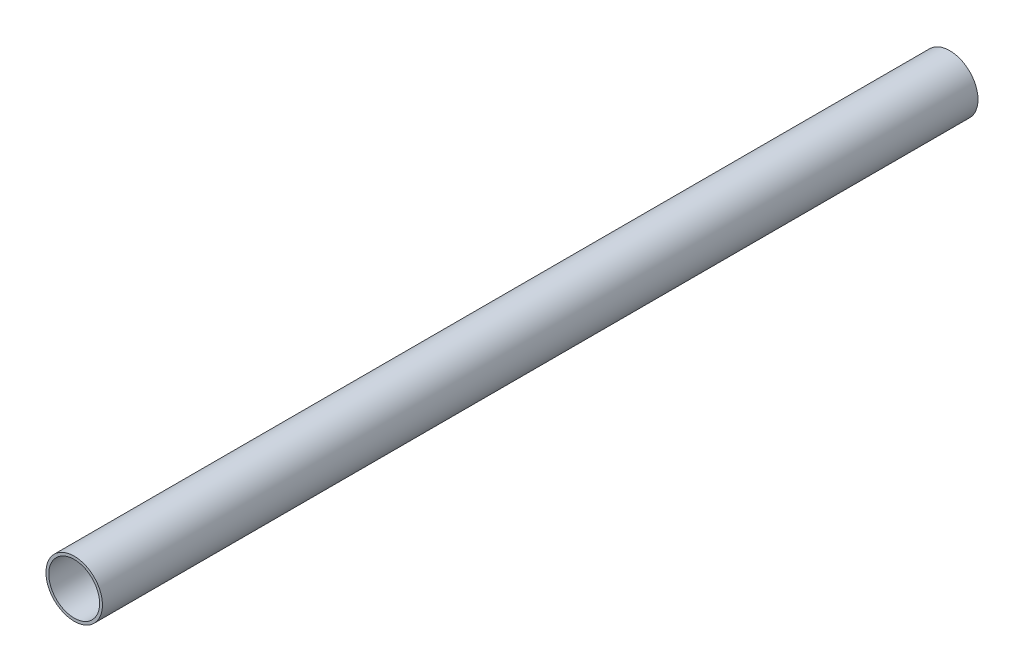
ISO-10303-21;
HEADER;
FILE_DESCRIPTION(('STEP AP214'),'2;1');
FILE_NAME('part.step','',(''),(''),'','','');
FILE_SCHEMA(('AUTOMOTIVE_DESIGN { 1 0 10303 214 1 1 1 1 }'));
ENDSEC;
DATA;
#1=APPLICATION_CONTEXT('core data for automotive mechanical design processes');
#2=APPLICATION_PROTOCOL_DEFINITION('international standard','automotive_design',2000,#1);
#3=PRODUCT_CONTEXT('',#1,'mechanical');
#4=PRODUCT('Part','Part','',(#3));
#5=PRODUCT_RELATED_PRODUCT_CATEGORY('part','',(#4));
#6=PRODUCT_DEFINITION_FORMATION('','',#4);
#7=PRODUCT_DEFINITION_CONTEXT('part definition',#1,'design');
#8=PRODUCT_DEFINITION('design','',#6,#7);
#9=PRODUCT_DEFINITION_SHAPE('','',#8);
#10=(LENGTH_UNIT() NAMED_UNIT(*) SI_UNIT(.MILLI.,.METRE.));
#11=(NAMED_UNIT(*) PLANE_ANGLE_UNIT() SI_UNIT($,.RADIAN.));
#12=(NAMED_UNIT(*) SI_UNIT($,.STERADIAN.) SOLID_ANGLE_UNIT());
#13=UNCERTAINTY_MEASURE_WITH_UNIT(LENGTH_MEASURE(1.E-05),#10,'distance_accuracy_value','');
#14=(GEOMETRIC_REPRESENTATION_CONTEXT(3) GLOBAL_UNCERTAINTY_ASSIGNED_CONTEXT((#13)) GLOBAL_UNIT_ASSIGNED_CONTEXT((#10,
#11,#12)) REPRESENTATION_CONTEXT('',''));
#15=CARTESIAN_POINT('',(0.,0.,0.));
#16=DIRECTION('',(0.,0.,1.));
#17=DIRECTION('',(1.,0.,0.));
#18=AXIS2_PLACEMENT_3D('',#15,#16,#17);
#19=CARTESIAN_POINT('',(0.,0.,155.));
#20=DIRECTION('',(0.,0.,1.));
#21=DIRECTION('',(1.,0.,0.));
#22=AXIS2_PLACEMENT_3D('',#19,#20,#21);
#23=PLANE('',#22);
#24=CARTESIAN_POINT('',(0.,0.,155.));
#25=DIRECTION('',(0.,0.,1.));
#26=DIRECTION('',(1.,0.,0.));
#27=AXIS2_PLACEMENT_3D('',#24,#25,#26);
#28=CIRCLE('',#27,10.);
#29=CARTESIAN_POINT('',(10.,0.,155.));
#30=VERTEX_POINT('',#29);
#31=EDGE_CURVE('E10',#30,#30,#28,.T.);
#32=ORIENTED_EDGE('',*,*,#31,.T.);
#33=EDGE_LOOP('',(#32));
#34=FACE_BOUND('',#33,.T.);
#35=CARTESIAN_POINT('',(0.,0.,155.));
#36=DIRECTION('',(0.,0.,1.));
#37=DIRECTION('',(1.,0.,0.));
#38=AXIS2_PLACEMENT_3D('',#35,#36,#37);
#39=CIRCLE('',#38,9.);
#40=CARTESIAN_POINT('',(9.,0.,155.));
#41=VERTEX_POINT('',#40);
#42=EDGE_CURVE('E44',#41,#41,#39,.T.);
#43=ORIENTED_EDGE('',*,*,#42,.F.);
#44=EDGE_LOOP('',(#43));
#45=FACE_BOUND('',#44,.T.);
#46=ADVANCED_FACE('F33',(#34,#45),#23,.T.);
#47=CARTESIAN_POINT('',(0.,0.,-155.));
#48=DIRECTION('',(0.,0.,1.));
#49=DIRECTION('',(1.,0.,0.));
#50=AXIS2_PLACEMENT_3D('',#47,#48,#49);
#51=PLANE('',#50);
#52=CARTESIAN_POINT('',(0.,0.,-155.));
#53=DIRECTION('',(0.,0.,1.));
#54=DIRECTION('',(1.,0.,0.));
#55=AXIS2_PLACEMENT_3D('',#52,#53,#54);
#56=CIRCLE('',#55,10.);
#57=CARTESIAN_POINT('',(10.,0.,-155.));
#58=VERTEX_POINT('',#57);
#59=EDGE_CURVE('E37',#58,#58,#56,.T.);
#60=ORIENTED_EDGE('',*,*,#59,.F.);
#61=EDGE_LOOP('',(#60));
#62=FACE_BOUND('',#61,.T.);
#63=CARTESIAN_POINT('',(0.,0.,-155.));
#64=DIRECTION('',(0.,0.,1.));
#65=DIRECTION('',(1.,0.,0.));
#66=AXIS2_PLACEMENT_3D('',#63,#64,#65);
#67=CIRCLE('',#66,9.);
#68=CARTESIAN_POINT('',(9.,0.,-155.));
#69=VERTEX_POINT('',#68);
#70=EDGE_CURVE('E46',#69,#69,#67,.T.);
#71=ORIENTED_EDGE('',*,*,#70,.T.);
#72=EDGE_LOOP('',(#71));
#73=FACE_BOUND('',#72,.T.);
#74=ADVANCED_FACE('F56',(#62,#73),#51,.F.);
#75=CARTESIAN_POINT('',(0.,0.,155.));
#76=DIRECTION('',(0.,0.,-1.));
#77=DIRECTION('',(-1.,0.,0.));
#78=AXIS2_PLACEMENT_3D('',#75,#76,#77);
#79=CYLINDRICAL_SURFACE('',#78,10.);
#80=ORIENTED_EDGE('',*,*,#31,.F.);
#81=EDGE_LOOP('',(#80));
#82=FACE_BOUND('',#81,.T.);
#83=ORIENTED_EDGE('',*,*,#59,.T.);
#84=EDGE_LOOP('',(#83));
#85=FACE_BOUND('',#84,.T.);
#86=ADVANCED_FACE('F35',(#82,#85),#79,.T.);
#87=CARTESIAN_POINT('',(0.,0.,155.));
#88=DIRECTION('',(0.,0.,-1.));
#89=DIRECTION('',(-1.,0.,0.));
#90=AXIS2_PLACEMENT_3D('',#87,#88,#89);
#91=CYLINDRICAL_SURFACE('',#90,9.);
#92=ORIENTED_EDGE('',*,*,#42,.T.);
#93=EDGE_LOOP('',(#92));
#94=FACE_BOUND('',#93,.T.);
#95=ORIENTED_EDGE('',*,*,#70,.F.);
#96=EDGE_LOOP('',(#95));
#97=FACE_BOUND('',#96,.T.);
#98=ADVANCED_FACE('F52',(#94,#97),#91,.F.);
#99=CLOSED_SHELL('',(#46,#74,#86,#98));
#100=MANIFOLD_SOLID_BREP('B2',#99);
#101=ADVANCED_BREP_SHAPE_REPRESENTATION('',(#18,#100),#14);
#102=SHAPE_DEFINITION_REPRESENTATION(#9,#101);
ENDSEC;
END-ISO-10303-21;
